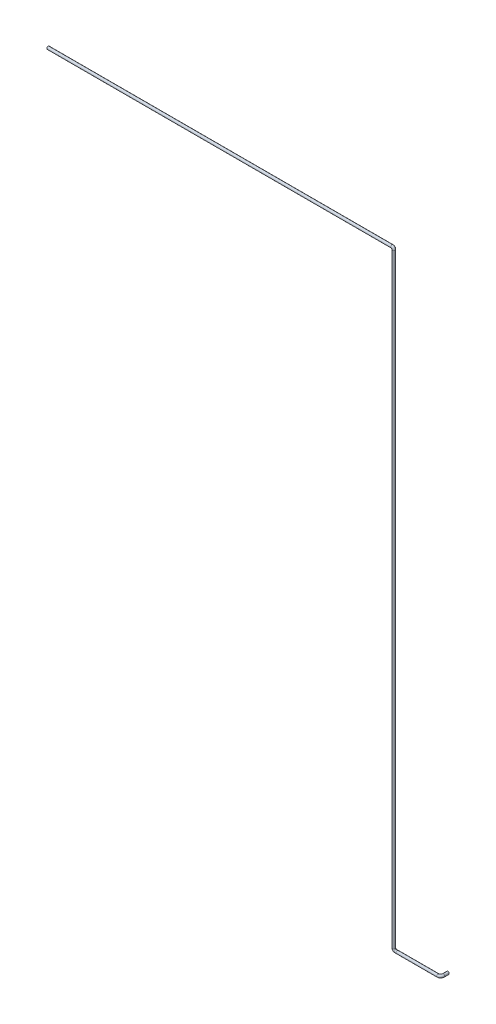
ISO-10303-21;
HEADER;
FILE_DESCRIPTION(('STEP AP214'),'2;1');
FILE_NAME('part.step','',(''),(''),'','','');
FILE_SCHEMA(('AUTOMOTIVE_DESIGN { 1 0 10303 214 1 1 1 1 }'));
ENDSEC;
DATA;
#1=APPLICATION_CONTEXT('core data for automotive mechanical design processes');
#2=APPLICATION_PROTOCOL_DEFINITION('international standard','automotive_design',2000,#1);
#3=PRODUCT_CONTEXT('',#1,'mechanical');
#4=PRODUCT('Part','Part','',(#3));
#5=PRODUCT_RELATED_PRODUCT_CATEGORY('part','',(#4));
#6=PRODUCT_DEFINITION_FORMATION('','',#4);
#7=PRODUCT_DEFINITION_CONTEXT('part definition',#1,'design');
#8=PRODUCT_DEFINITION('design','',#6,#7);
#9=PRODUCT_DEFINITION_SHAPE('','',#8);
#10=(LENGTH_UNIT() NAMED_UNIT(*) SI_UNIT(.MILLI.,.METRE.));
#11=(NAMED_UNIT(*) PLANE_ANGLE_UNIT() SI_UNIT($,.RADIAN.));
#12=(NAMED_UNIT(*) SI_UNIT($,.STERADIAN.) SOLID_ANGLE_UNIT());
#13=UNCERTAINTY_MEASURE_WITH_UNIT(LENGTH_MEASURE(1.E-05),#10,'distance_accuracy_value','');
#14=(GEOMETRIC_REPRESENTATION_CONTEXT(3) GLOBAL_UNCERTAINTY_ASSIGNED_CONTEXT((#13)) GLOBAL_UNIT_ASSIGNED_CONTEXT((#10,
#11,#12)) REPRESENTATION_CONTEXT('',''));
#15=CARTESIAN_POINT('',(0.,0.,0.));
#16=DIRECTION('',(0.,0.,1.));
#17=DIRECTION('',(1.,0.,0.));
#18=AXIS2_PLACEMENT_3D('',#15,#16,#17);
#19=CARTESIAN_POINT('',(0.,0.,0.));
#20=DIRECTION('',(0.,0.,1.));
#21=DIRECTION('',(1.,0.,0.));
#22=AXIS2_PLACEMENT_3D('',#19,#20,#21);
#23=CYLINDRICAL_SURFACE('',#22,9.525);
#24=CARTESIAN_POINT('',(0.,0.,31.75));
#25=DIRECTION('',(0.,0.,1.));
#26=DIRECTION('',(1.,0.,0.));
#27=AXIS2_PLACEMENT_3D('',#24,#25,#26);
#28=CIRCLE('',#27,9.525);
#29=CARTESIAN_POINT('',(9.525,0.,31.75));
#30=VERTEX_POINT('',#29);
#31=EDGE_CURVE('E82',#30,#30,#28,.T.);
#32=ORIENTED_EDGE('',*,*,#31,.F.);
#33=EDGE_LOOP('',(#32));
#34=FACE_BOUND('',#33,.T.);
#35=CARTESIAN_POINT('',(0.,0.,0.));
#36=DIRECTION('',(0.,0.,1.));
#37=DIRECTION('',(1.,0.,0.));
#38=AXIS2_PLACEMENT_3D('',#35,#36,#37);
#39=CIRCLE('',#38,9.525);
#40=CARTESIAN_POINT('',(9.525,0.,0.));
#41=VERTEX_POINT('',#40);
#42=EDGE_CURVE('E49',#41,#41,#39,.T.);
#43=ORIENTED_EDGE('',*,*,#42,.T.);
#44=EDGE_LOOP('',(#43));
#45=FACE_BOUND('',#44,.T.);
#46=ADVANCED_FACE('F34',(#34,#45),#23,.T.);
#47=CARTESIAN_POINT('',(-19.05,0.,31.75));
#48=DIRECTION('',(0.,-1.,0.));
#49=DIRECTION('',(0.,0.,-1.));
#50=AXIS2_PLACEMENT_3D('',#47,#48,#49);
#51=TOROIDAL_SURFACE('',#50,19.05,9.525);
#52=CARTESIAN_POINT('',(-19.05,0.,50.8));
#53=DIRECTION('',(-1.,0.,0.));
#54=DIRECTION('',(0.,0.,1.));
#55=AXIS2_PLACEMENT_3D('',#52,#53,#54);
#56=CIRCLE('',#55,9.525);
#57=CARTESIAN_POINT('',(-19.05,0.,60.325));
#58=VERTEX_POINT('',#57);
#59=EDGE_CURVE('E85',#58,#58,#56,.T.);
#60=CARTESIAN_POINT('',(-19.05,0.,31.75));
#61=DIRECTION('',(0.,-1.,0.));
#62=DIRECTION('',(0.,0.,-1.));
#63=AXIS2_PLACEMENT_3D('',#60,#61,#62);
#64=CIRCLE('',#63,28.575);
#65=EDGE_CURVE('',#30,#58,#64,.T.);
#66=ORIENTED_EDGE('',*,*,#31,.T.);
#67=ORIENTED_EDGE('',*,*,#59,.F.);
#68=ORIENTED_EDGE('',*,*,#65,.T.);
#69=ORIENTED_EDGE('',*,*,#65,.F.);
#70=EDGE_LOOP('',(#66,#68,#67,#69));
#71=FACE_BOUND('',#70,.T.);
#72=ADVANCED_FACE('F126',(#71),#51,.T.);
#73=CARTESIAN_POINT('',(-19.05,0.,50.8));
#74=DIRECTION('',(-1.,0.,0.));
#75=DIRECTION('',(0.,0.,1.));
#76=AXIS2_PLACEMENT_3D('',#73,#74,#75);
#77=CYLINDRICAL_SURFACE('',#76,9.525);
#78=CARTESIAN_POINT('',(-304.8,0.,50.8));
#79=DIRECTION('',(-1.,0.,0.));
#80=DIRECTION('',(0.,0.,1.));
#81=AXIS2_PLACEMENT_3D('',#78,#79,#80);
#82=CIRCLE('',#81,9.525);
#83=CARTESIAN_POINT('',(-304.8,0.,60.325));
#84=VERTEX_POINT('',#83);
#85=EDGE_CURVE('E88',#84,#84,#82,.T.);
#86=ORIENTED_EDGE('',*,*,#85,.F.);
#87=EDGE_LOOP('',(#86));
#88=FACE_BOUND('',#87,.T.);
#89=ORIENTED_EDGE('',*,*,#59,.T.);
#90=EDGE_LOOP('',(#89));
#91=FACE_BOUND('',#90,.T.);
#92=ADVANCED_FACE('F122',(#88,#91),#77,.T.);
#93=CARTESIAN_POINT('',(-304.8,0.,50.8));
#94=DIRECTION('',(-1.,0.,0.));
#95=DIRECTION('',(0.,0.,1.));
#96=AXIS2_PLACEMENT_3D('',#93,#94,#95);
#97=CYLINDRICAL_SURFACE('',#96,9.525);
#98=CARTESIAN_POINT('',(-317.5,0.,50.8));
#99=DIRECTION('',(-1.,0.,0.));
#100=DIRECTION('',(0.,0.,1.));
#101=AXIS2_PLACEMENT_3D('',#98,#99,#100);
#102=CIRCLE('',#101,9.525);
#103=CARTESIAN_POINT('',(-317.5,-9.525,50.8));
#104=VERTEX_POINT('',#103);
#105=EDGE_CURVE('E91',#104,#104,#102,.T.);
#106=ORIENTED_EDGE('',*,*,#105,.F.);
#107=EDGE_LOOP('',(#106));
#108=FACE_BOUND('',#107,.T.);
#109=ORIENTED_EDGE('',*,*,#85,.T.);
#110=EDGE_LOOP('',(#109));
#111=FACE_BOUND('',#110,.T.);
#112=ADVANCED_FACE('F118',(#108,#111),#97,.T.);
#113=CARTESIAN_POINT('',(-317.5,12.7,50.8));
#114=DIRECTION('',(0.,0.,-1.));
#115=DIRECTION('',(-1.,0.,0.));
#116=AXIS2_PLACEMENT_3D('',#113,#114,#115);
#117=TOROIDAL_SURFACE('',#116,12.7,9.525);
#118=CARTESIAN_POINT('',(-330.2,12.7,50.8));
#119=DIRECTION('',(0.,1.,0.));
#120=DIRECTION('',(0.,0.,1.));
#121=AXIS2_PLACEMENT_3D('',#118,#119,#120);
#122=CIRCLE('',#121,9.525);
#123=CARTESIAN_POINT('',(-339.725,12.7,50.8));
#124=VERTEX_POINT('',#123);
#125=EDGE_CURVE('E94',#124,#124,#122,.T.);
#126=CARTESIAN_POINT('',(-317.5,12.7,50.8));
#127=DIRECTION('',(0.,0.,-1.));
#128=DIRECTION('',(-1.,0.,0.));
#129=AXIS2_PLACEMENT_3D('',#126,#127,#128);
#130=CIRCLE('',#129,22.225);
#131=EDGE_CURVE('',#104,#124,#130,.T.);
#132=ORIENTED_EDGE('',*,*,#105,.T.);
#133=ORIENTED_EDGE('',*,*,#125,.F.);
#134=ORIENTED_EDGE('',*,*,#131,.T.);
#135=ORIENTED_EDGE('',*,*,#131,.F.);
#136=EDGE_LOOP('',(#132,#134,#133,#135));
#137=FACE_BOUND('',#136,.T.);
#138=ADVANCED_FACE('F112',(#137),#117,.T.);
#139=CARTESIAN_POINT('',(-330.2,12.7,50.8));
#140=DIRECTION('',(0.,1.,0.));
#141=DIRECTION('',(0.,0.,1.));
#142=AXIS2_PLACEMENT_3D('',#139,#140,#141);
#143=CYLINDRICAL_SURFACE('',#142,9.525);
#144=CARTESIAN_POINT('',(-330.2,4279.9,50.8));
#145=DIRECTION('',(0.,1.,0.));
#146=DIRECTION('',(0.,0.,1.));
#147=AXIS2_PLACEMENT_3D('',#144,#145,#146);
#148=CIRCLE('',#147,9.525);
#149=CARTESIAN_POINT('',(-320.675,4279.9,50.8));
#150=VERTEX_POINT('',#149);
#151=EDGE_CURVE('E96',#150,#150,#148,.T.);
#152=ORIENTED_EDGE('',*,*,#151,.F.);
#153=EDGE_LOOP('',(#152));
#154=FACE_BOUND('',#153,.T.);
#155=ORIENTED_EDGE('',*,*,#125,.T.);
#156=EDGE_LOOP('',(#155));
#157=FACE_BOUND('',#156,.T.);
#158=ADVANCED_FACE('F106',(#154,#157),#143,.T.);
#159=CARTESIAN_POINT('',(-342.9,4279.9,50.8));
#160=DIRECTION('',(0.,0.,1.));
#161=DIRECTION('',(1.,0.,0.));
#162=AXIS2_PLACEMENT_3D('',#159,#160,#161);
#163=TOROIDAL_SURFACE('',#162,12.6999999999998,9.525);
#164=CARTESIAN_POINT('',(-342.9,4292.6,50.8));
#165=DIRECTION('',(-1.,0.,0.));
#166=DIRECTION('',(0.,0.,1.));
#167=AXIS2_PLACEMENT_3D('',#164,#165,#166);
#168=CIRCLE('',#167,9.525);
#169=CARTESIAN_POINT('',(-342.9,4302.125,50.8));
#170=VERTEX_POINT('',#169);
#171=EDGE_CURVE('E38',#170,#170,#168,.T.);
#172=CARTESIAN_POINT('',(-342.9,4279.9,50.8));
#173=DIRECTION('',(0.,0.,1.));
#174=DIRECTION('',(1.,0.,0.));
#175=AXIS2_PLACEMENT_3D('',#172,#173,#174);
#176=CIRCLE('',#175,22.2249999999998);
#177=EDGE_CURVE('',#150,#170,#176,.T.);
#178=ORIENTED_EDGE('',*,*,#151,.T.);
#179=ORIENTED_EDGE('',*,*,#171,.F.);
#180=ORIENTED_EDGE('',*,*,#177,.T.);
#181=ORIENTED_EDGE('',*,*,#177,.F.);
#182=EDGE_LOOP('',(#178,#180,#179,#181));
#183=FACE_BOUND('',#182,.T.);
#184=ADVANCED_FACE('F104',(#183),#163,.T.);
#185=CARTESIAN_POINT('',(-342.9,4292.6,50.8));
#186=DIRECTION('',(-1.,0.,0.));
#187=DIRECTION('',(0.,0.,1.));
#188=AXIS2_PLACEMENT_3D('',#185,#186,#187);
#189=CYLINDRICAL_SURFACE('',#188,9.525);
#190=CARTESIAN_POINT('',(-2768.6,4292.6,50.8000000000004));
#191=DIRECTION('',(-1.,0.,0.));
#192=DIRECTION('',(0.,0.,1.));
#193=AXIS2_PLACEMENT_3D('',#190,#191,#192);
#194=CIRCLE('',#193,9.525);
#195=CARTESIAN_POINT('',(-2768.6,4292.6,60.3250000000004));
#196=VERTEX_POINT('',#195);
#197=EDGE_CURVE('E54',#196,#196,#194,.T.);
#198=ORIENTED_EDGE('',*,*,#197,.F.);
#199=EDGE_LOOP('',(#198));
#200=FACE_BOUND('',#199,.T.);
#201=ORIENTED_EDGE('',*,*,#171,.T.);
#202=EDGE_LOOP('',(#201));
#203=FACE_BOUND('',#202,.T.);
#204=ADVANCED_FACE('F36',(#200,#203),#189,.T.);
#205=CARTESIAN_POINT('',(0.,0.,0.));
#206=DIRECTION('',(0.,0.,1.));
#207=DIRECTION('',(1.,0.,0.));
#208=AXIS2_PLACEMENT_3D('',#205,#206,#207);
#209=PLANE('',#208);
#210=CARTESIAN_POINT('',(0.,0.,0.));
#211=DIRECTION('',(0.,0.,1.));
#212=DIRECTION('',(1.,0.,0.));
#213=AXIS2_PLACEMENT_3D('',#210,#211,#212);
#214=CIRCLE('',#213,6.985);
#215=CARTESIAN_POINT('',(6.985,0.,0.));
#216=VERTEX_POINT('',#215);
#217=EDGE_CURVE('E80',#216,#216,#214,.F.);
#218=ORIENTED_EDGE('',*,*,#217,.F.);
#219=EDGE_LOOP('',(#218));
#220=FACE_BOUND('',#219,.T.);
#221=ORIENTED_EDGE('',*,*,#42,.F.);
#222=EDGE_LOOP('',(#221));
#223=FACE_BOUND('',#222,.T.);
#224=ADVANCED_FACE('F111',(#220,#223),#209,.F.);
#225=CARTESIAN_POINT('',(-2768.6,4292.6,50.8000000000004));
#226=DIRECTION('',(-1.,0.,0.));
#227=DIRECTION('',(0.,0.,1.));
#228=AXIS2_PLACEMENT_3D('',#225,#226,#227);
#229=PLANE('',#228);
#230=CARTESIAN_POINT('',(-2768.6,4292.6,50.8000000000004));
#231=DIRECTION('',(-1.,0.,0.));
#232=DIRECTION('',(0.,0.,1.));
#233=AXIS2_PLACEMENT_3D('',#230,#231,#232);
#234=CIRCLE('',#233,6.985);
#235=CARTESIAN_POINT('',(-2768.6,4292.6,57.7850000000004));
#236=VERTEX_POINT('',#235);
#237=EDGE_CURVE('E11',#236,#236,#234,.F.);
#238=ORIENTED_EDGE('',*,*,#237,.T.);
#239=EDGE_LOOP('',(#238));
#240=FACE_BOUND('',#239,.T.);
#241=ORIENTED_EDGE('',*,*,#197,.T.);
#242=EDGE_LOOP('',(#241));
#243=FACE_BOUND('',#242,.T.);
#244=ADVANCED_FACE('F61',(#240,#243),#229,.T.);
#245=CARTESIAN_POINT('',(0.,0.,0.));
#246=DIRECTION('',(0.,0.,1.));
#247=DIRECTION('',(1.,0.,0.));
#248=AXIS2_PLACEMENT_3D('',#245,#246,#247);
#249=CYLINDRICAL_SURFACE('',#248,6.985);
#250=CARTESIAN_POINT('',(0.,0.,31.75));
#251=DIRECTION('',(0.,0.,1.));
#252=DIRECTION('',(1.,0.,0.));
#253=AXIS2_PLACEMENT_3D('',#250,#251,#252);
#254=CIRCLE('',#253,6.985);
#255=CARTESIAN_POINT('',(6.98499999999999,0.,31.75));
#256=VERTEX_POINT('',#255);
#257=EDGE_CURVE('E169',#256,#256,#254,.F.);
#258=ORIENTED_EDGE('',*,*,#257,.F.);
#259=EDGE_LOOP('',(#258));
#260=FACE_BOUND('',#259,.T.);
#261=ORIENTED_EDGE('',*,*,#217,.T.);
#262=EDGE_LOOP('',(#261));
#263=FACE_BOUND('',#262,.T.);
#264=ADVANCED_FACE('F138',(#260,#263),#249,.F.);
#265=CARTESIAN_POINT('',(-19.05,0.,31.75));
#266=DIRECTION('',(0.,-1.,0.));
#267=DIRECTION('',(0.,0.,-1.));
#268=AXIS2_PLACEMENT_3D('',#265,#266,#267);
#269=TOROIDAL_SURFACE('',#268,19.05,6.985);
#270=CARTESIAN_POINT('',(-19.05,0.,50.8));
#271=DIRECTION('',(-1.,0.,0.));
#272=DIRECTION('',(0.,0.,1.));
#273=AXIS2_PLACEMENT_3D('',#270,#271,#272);
#274=CIRCLE('',#273,6.985);
#275=CARTESIAN_POINT('',(-19.05,0.,57.785));
#276=VERTEX_POINT('',#275);
#277=EDGE_CURVE('E172',#276,#276,#274,.F.);
#278=CARTESIAN_POINT('',(-19.05,0.,31.75));
#279=DIRECTION('',(0.,-1.,0.));
#280=DIRECTION('',(0.,0.,-1.));
#281=AXIS2_PLACEMENT_3D('',#278,#279,#280);
#282=CIRCLE('',#281,26.035);
#283=EDGE_CURVE('',#256,#276,#282,.T.);
#284=ORIENTED_EDGE('',*,*,#257,.T.);
#285=ORIENTED_EDGE('',*,*,#277,.F.);
#286=ORIENTED_EDGE('',*,*,#283,.T.);
#287=ORIENTED_EDGE('',*,*,#283,.F.);
#288=EDGE_LOOP('',(#284,#286,#285,#287));
#289=FACE_BOUND('',#288,.T.);
#290=ADVANCED_FACE('F157',(#289),#269,.F.);
#291=CARTESIAN_POINT('',(-19.05,0.,50.8));
#292=DIRECTION('',(-1.,0.,0.));
#293=DIRECTION('',(0.,0.,1.));
#294=AXIS2_PLACEMENT_3D('',#291,#292,#293);
#295=CYLINDRICAL_SURFACE('',#294,6.985);
#296=CARTESIAN_POINT('',(-304.8,0.,50.8));
#297=DIRECTION('',(-1.,0.,0.));
#298=DIRECTION('',(0.,0.,1.));
#299=AXIS2_PLACEMENT_3D('',#296,#297,#298);
#300=CIRCLE('',#299,6.985);
#301=CARTESIAN_POINT('',(-304.8,0.,57.785));
#302=VERTEX_POINT('',#301);
#303=EDGE_CURVE('E177',#302,#302,#300,.F.);
#304=ORIENTED_EDGE('',*,*,#303,.F.);
#305=EDGE_LOOP('',(#304));
#306=FACE_BOUND('',#305,.T.);
#307=ORIENTED_EDGE('',*,*,#277,.T.);
#308=EDGE_LOOP('',(#307));
#309=FACE_BOUND('',#308,.T.);
#310=ADVANCED_FACE('F153',(#306,#309),#295,.F.);
#311=CARTESIAN_POINT('',(-304.8,0.,50.8));
#312=DIRECTION('',(-1.,0.,0.));
#313=DIRECTION('',(0.,0.,1.));
#314=AXIS2_PLACEMENT_3D('',#311,#312,#313);
#315=CYLINDRICAL_SURFACE('',#314,6.985);
#316=CARTESIAN_POINT('',(-317.5,0.,50.8));
#317=DIRECTION('',(-1.,0.,0.));
#318=DIRECTION('',(0.,0.,1.));
#319=AXIS2_PLACEMENT_3D('',#316,#317,#318);
#320=CIRCLE('',#319,6.985);
#321=CARTESIAN_POINT('',(-317.5,-6.98499999999999,50.8));
#322=VERTEX_POINT('',#321);
#323=EDGE_CURVE('E180',#322,#322,#320,.F.);
#324=ORIENTED_EDGE('',*,*,#323,.F.);
#325=EDGE_LOOP('',(#324));
#326=FACE_BOUND('',#325,.T.);
#327=ORIENTED_EDGE('',*,*,#303,.T.);
#328=EDGE_LOOP('',(#327));
#329=FACE_BOUND('',#328,.T.);
#330=ADVANCED_FACE('F149',(#326,#329),#315,.F.);
#331=CARTESIAN_POINT('',(-317.5,12.7,50.8));
#332=DIRECTION('',(0.,0.,-1.));
#333=DIRECTION('',(-1.,0.,0.));
#334=AXIS2_PLACEMENT_3D('',#331,#332,#333);
#335=TOROIDAL_SURFACE('',#334,12.7,6.985);
#336=CARTESIAN_POINT('',(-330.2,12.7,50.8));
#337=DIRECTION('',(0.,1.,0.));
#338=DIRECTION('',(0.,0.,1.));
#339=AXIS2_PLACEMENT_3D('',#336,#337,#338);
#340=CIRCLE('',#339,6.985);
#341=CARTESIAN_POINT('',(-337.185,12.7,50.8));
#342=VERTEX_POINT('',#341);
#343=EDGE_CURVE('E75',#342,#342,#340,.F.);
#344=CARTESIAN_POINT('',(-317.5,12.7,50.8));
#345=DIRECTION('',(0.,0.,-1.));
#346=DIRECTION('',(-1.,0.,0.));
#347=AXIS2_PLACEMENT_3D('',#344,#345,#346);
#348=CIRCLE('',#347,19.685);
#349=EDGE_CURVE('',#322,#342,#348,.T.);
#350=ORIENTED_EDGE('',*,*,#323,.T.);
#351=ORIENTED_EDGE('',*,*,#343,.F.);
#352=ORIENTED_EDGE('',*,*,#349,.T.);
#353=ORIENTED_EDGE('',*,*,#349,.F.);
#354=EDGE_LOOP('',(#350,#352,#351,#353));
#355=FACE_BOUND('',#354,.T.);
#356=ADVANCED_FACE('F145',(#355),#335,.F.);
#357=CARTESIAN_POINT('',(-330.2,12.7,50.8));
#358=DIRECTION('',(0.,1.,0.));
#359=DIRECTION('',(0.,0.,1.));
#360=AXIS2_PLACEMENT_3D('',#357,#358,#359);
#361=CYLINDRICAL_SURFACE('',#360,6.985);
#362=CARTESIAN_POINT('',(-330.2,4279.9,50.8));
#363=DIRECTION('',(0.,1.,0.));
#364=DIRECTION('',(0.,0.,1.));
#365=AXIS2_PLACEMENT_3D('',#362,#363,#364);
#366=CIRCLE('',#365,6.985);
#367=CARTESIAN_POINT('',(-323.215,4279.9,50.8));
#368=VERTEX_POINT('',#367);
#369=EDGE_CURVE('E72',#368,#368,#366,.F.);
#370=ORIENTED_EDGE('',*,*,#369,.F.);
#371=EDGE_LOOP('',(#370));
#372=FACE_BOUND('',#371,.T.);
#373=ORIENTED_EDGE('',*,*,#343,.T.);
#374=EDGE_LOOP('',(#373));
#375=FACE_BOUND('',#374,.T.);
#376=ADVANCED_FACE('F142',(#372,#375),#361,.F.);
#377=CARTESIAN_POINT('',(-342.9,4279.9,50.8));
#378=DIRECTION('',(0.,0.,1.));
#379=DIRECTION('',(1.,0.,0.));
#380=AXIS2_PLACEMENT_3D('',#377,#378,#379);
#381=TOROIDAL_SURFACE('',#380,12.6999999999998,6.985);
#382=CARTESIAN_POINT('',(-342.9,4292.6,50.8));
#383=DIRECTION('',(-1.,0.,0.));
#384=DIRECTION('',(0.,0.,1.));
#385=AXIS2_PLACEMENT_3D('',#382,#383,#384);
#386=CIRCLE('',#385,6.985);
#387=CARTESIAN_POINT('',(-342.9,4299.585,50.8));
#388=VERTEX_POINT('',#387);
#389=EDGE_CURVE('E43',#388,#388,#386,.F.);
#390=CARTESIAN_POINT('',(-342.9,4279.9,50.8));
#391=DIRECTION('',(0.,0.,1.));
#392=DIRECTION('',(1.,0.,0.));
#393=AXIS2_PLACEMENT_3D('',#390,#391,#392);
#394=CIRCLE('',#393,19.6849999999998);
#395=EDGE_CURVE('',#368,#388,#394,.T.);
#396=ORIENTED_EDGE('',*,*,#369,.T.);
#397=ORIENTED_EDGE('',*,*,#389,.F.);
#398=ORIENTED_EDGE('',*,*,#395,.T.);
#399=ORIENTED_EDGE('',*,*,#395,.F.);
#400=EDGE_LOOP('',(#396,#398,#397,#399));
#401=FACE_BOUND('',#400,.T.);
#402=ADVANCED_FACE('F67',(#401),#381,.F.);
#403=CARTESIAN_POINT('',(-342.9,4292.6,50.8));
#404=DIRECTION('',(-1.,0.,0.));
#405=DIRECTION('',(0.,0.,1.));
#406=AXIS2_PLACEMENT_3D('',#403,#404,#405);
#407=CYLINDRICAL_SURFACE('',#406,6.985);
#408=ORIENTED_EDGE('',*,*,#237,.F.);
#409=EDGE_LOOP('',(#408));
#410=FACE_BOUND('',#409,.T.);
#411=ORIENTED_EDGE('',*,*,#389,.T.);
#412=EDGE_LOOP('',(#411));
#413=FACE_BOUND('',#412,.T.);
#414=ADVANCED_FACE('F64',(#410,#413),#407,.F.);
#415=CLOSED_SHELL('',(#46,#72,#92,#112,#138,#158,#184,#204,#224,#244,#264,#290,#310,#330,#356,
#376,#402,#414));
#416=MANIFOLD_SOLID_BREP('B2',#415);
#417=ADVANCED_BREP_SHAPE_REPRESENTATION('',(#18,#416),#14);
#418=SHAPE_DEFINITION_REPRESENTATION(#9,#417);
ENDSEC;
END-ISO-10303-21;
